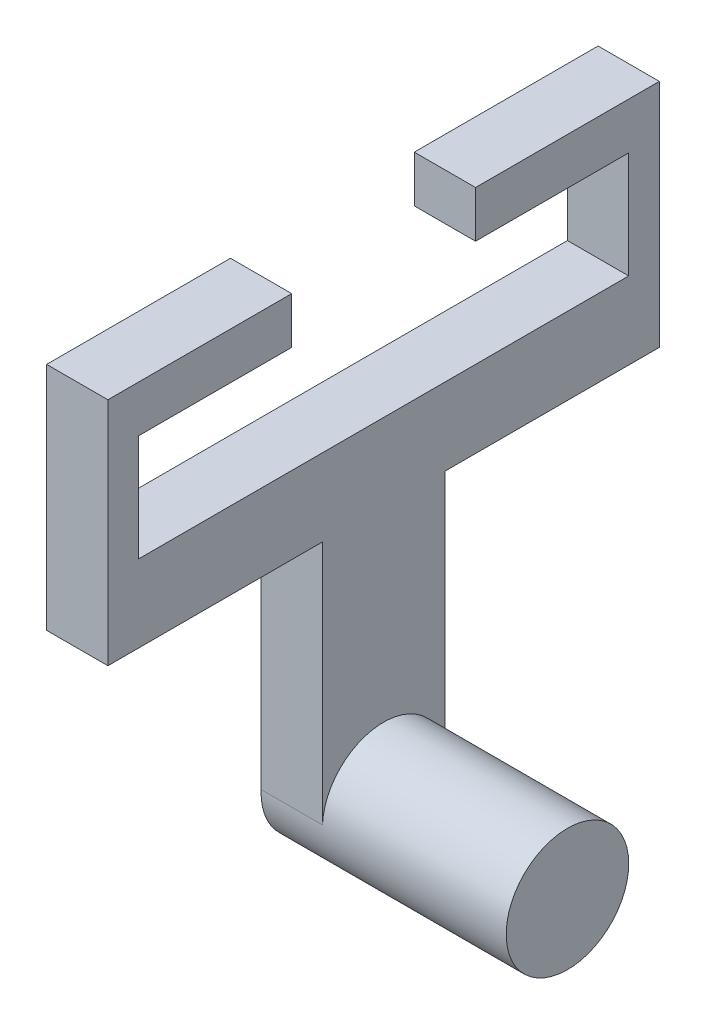
ISO-10303-21;
HEADER;
FILE_DESCRIPTION(('STEP AP214'),'2;1');
FILE_NAME('part.step','',(''),(''),'','','');
FILE_SCHEMA(('AUTOMOTIVE_DESIGN { 1 0 10303 214 1 1 1 1 }'));
ENDSEC;
DATA;
#1=APPLICATION_CONTEXT('core data for automotive mechanical design processes');
#2=APPLICATION_PROTOCOL_DEFINITION('international standard','automotive_design',2000,#1);
#3=PRODUCT_CONTEXT('',#1,'mechanical');
#4=PRODUCT('Part','Part','',(#3));
#5=PRODUCT_RELATED_PRODUCT_CATEGORY('part','',(#4));
#6=PRODUCT_DEFINITION_FORMATION('','',#4);
#7=PRODUCT_DEFINITION_CONTEXT('part definition',#1,'design');
#8=PRODUCT_DEFINITION('design','',#6,#7);
#9=PRODUCT_DEFINITION_SHAPE('','',#8);
#10=(LENGTH_UNIT() NAMED_UNIT(*) SI_UNIT(.MILLI.,.METRE.));
#11=(NAMED_UNIT(*) PLANE_ANGLE_UNIT() SI_UNIT($,.RADIAN.));
#12=(NAMED_UNIT(*) SI_UNIT($,.STERADIAN.) SOLID_ANGLE_UNIT());
#13=UNCERTAINTY_MEASURE_WITH_UNIT(LENGTH_MEASURE(1.E-05),#10,'distance_accuracy_value','');
#14=(GEOMETRIC_REPRESENTATION_CONTEXT(3) GLOBAL_UNCERTAINTY_ASSIGNED_CONTEXT((#13)) GLOBAL_UNIT_ASSIGNED_CONTEXT((#10,
#11,#12)) REPRESENTATION_CONTEXT('',''));
#15=CARTESIAN_POINT('',(0.,0.,0.));
#16=DIRECTION('',(0.,0.,1.));
#17=DIRECTION('',(1.,0.,0.));
#18=AXIS2_PLACEMENT_3D('',#15,#16,#17);
#19=CARTESIAN_POINT('',(12.7,0.60873287463422,-12.6854028035116));
#20=DIRECTION('',(0.,0.,-1.));
#21=DIRECTION('',(-1.,0.,0.));
#22=AXIS2_PLACEMENT_3D('',#19,#20,#21);
#23=PLANE('',#22);
#24=DIRECTION('',(0.,-1.,0.));
#25=VECTOR('',#24,1.);
#26=CARTESIAN_POINT('',(0.,0.60873287463422,-12.6854028035116));
#27=LINE('',#26,#25);
#28=CARTESIAN_POINT('',(0.,51.3912941545788,-12.6854028035116));
#29=VERTEX_POINT('',#28);
#30=CARTESIAN_POINT('',(0.,0.60873287463422,-12.6854028035116));
#31=VERTEX_POINT('',#30);
#32=EDGE_CURVE('E277',#29,#31,#27,.T.);
#33=ORIENTED_EDGE('',*,*,#32,.F.);
#34=DIRECTION('',(1.,0.,0.));
#35=VECTOR('',#34,1.);
#36=CARTESIAN_POINT('',(12.7,51.3912941545788,-12.6854028035116));
#37=LINE('',#36,#35);
#38=CARTESIAN_POINT('',(12.7,51.3912941545788,-12.6854028035116));
#39=VERTEX_POINT('',#38);
#40=EDGE_CURVE('E273',#29,#39,#37,.T.);
#41=ORIENTED_EDGE('',*,*,#40,.T.);
#42=DIRECTION('',(0.,-1.,0.));
#43=VECTOR('',#42,1.);
#44=CARTESIAN_POINT('',(12.7,0.60873287463422,-12.6854028035116));
#45=LINE('',#44,#43);
#46=CARTESIAN_POINT('',(12.7,0.60873287463422,-12.6854028035116));
#47=VERTEX_POINT('',#46);
#48=EDGE_CURVE('E280',#39,#47,#45,.T.);
#49=ORIENTED_EDGE('',*,*,#48,.T.);
#50=DIRECTION('',(-1.,0.,0.));
#51=VECTOR('',#50,1.);
#52=CARTESIAN_POINT('',(12.7,0.60873287463422,-12.6854028035116));
#53=LINE('',#52,#51);
#54=EDGE_CURVE('E288',#47,#31,#53,.T.);
#55=ORIENTED_EDGE('',*,*,#54,.T.);
#56=EDGE_LOOP('',(#33,#41,#49,#55));
#57=FACE_BOUND('',#56,.T.);
#58=ADVANCED_FACE('F47',(#57),#23,.T.);
#59=CARTESIAN_POINT('',(12.7,0.60873287463422,12.7145971964884));
#60=DIRECTION('',(0.,0.,1.));
#61=DIRECTION('',(1.,0.,0.));
#62=AXIS2_PLACEMENT_3D('',#59,#60,#61);
#63=PLANE('',#62);
#64=DIRECTION('',(0.,1.,0.));
#65=VECTOR('',#64,1.);
#66=CARTESIAN_POINT('',(12.7,0.60873287463422,12.7145971964884));
#67=LINE('',#66,#65);
#68=CARTESIAN_POINT('',(12.7,0.60873287463422,12.7145971964884));
#69=VERTEX_POINT('',#68);
#70=CARTESIAN_POINT('',(12.7,51.3912941545788,12.7145971964884));
#71=VERTEX_POINT('',#70);
#72=EDGE_CURVE('E283',#69,#71,#67,.T.);
#73=ORIENTED_EDGE('',*,*,#72,.T.);
#74=DIRECTION('',(-1.,0.,0.));
#75=VECTOR('',#74,1.);
#76=CARTESIAN_POINT('',(12.7,51.3912941545788,12.7145971964884));
#77=LINE('',#76,#75);
#78=CARTESIAN_POINT('',(0.,51.3912941545788,12.7145971964884));
#79=VERTEX_POINT('',#78);
#80=EDGE_CURVE('E11',#71,#79,#77,.T.);
#81=ORIENTED_EDGE('',*,*,#80,.T.);
#82=DIRECTION('',(0.,1.,0.));
#83=VECTOR('',#82,1.);
#84=CARTESIAN_POINT('',(0.,0.60873287463422,12.7145971964884));
#85=LINE('',#84,#83);
#86=CARTESIAN_POINT('',(0.,0.60873287463422,12.7145971964884));
#87=VERTEX_POINT('',#86);
#88=EDGE_CURVE('E281',#87,#79,#85,.T.);
#89=ORIENTED_EDGE('',*,*,#88,.F.);
#90=DIRECTION('',(-1.,0.,0.));
#91=VECTOR('',#90,1.);
#92=CARTESIAN_POINT('',(12.7,0.60873287463422,12.7145971964884));
#93=LINE('',#92,#91);
#94=EDGE_CURVE('E293',#69,#87,#93,.T.);
#95=ORIENTED_EDGE('',*,*,#94,.F.);
#96=EDGE_LOOP('',(#73,#81,#89,#95));
#97=FACE_BOUND('',#96,.T.);
#98=ADVANCED_FACE('F354',(#97),#63,.T.);
#99=CARTESIAN_POINT('',(50.8,0.,0.));
#100=DIRECTION('',(-1.,0.,0.));
#101=DIRECTION('',(0.,0.,1.));
#102=AXIS2_PLACEMENT_3D('',#99,#100,#101);
#103=CYLINDRICAL_SURFACE('',#102,12.7);
#104=CARTESIAN_POINT('',(50.8,0.,0.));
#105=DIRECTION('',(1.,0.,0.));
#106=DIRECTION('',(0.,0.,-1.));
#107=AXIS2_PLACEMENT_3D('',#104,#105,#106);
#108=CIRCLE('',#107,12.7);
#109=CARTESIAN_POINT('',(50.8,0.,-12.7));
#110=VERTEX_POINT('',#109);
#111=EDGE_CURVE('E296',#110,#110,#108,.T.);
#112=ORIENTED_EDGE('',*,*,#111,.F.);
#113=EDGE_LOOP('',(#112));
#114=FACE_BOUND('',#113,.T.);
#115=CARTESIAN_POINT('',(12.7,0.,0.));
#116=DIRECTION('',(1.,0.,0.));
#117=DIRECTION('',(0.,0.,-1.));
#118=AXIS2_PLACEMENT_3D('',#115,#116,#117);
#119=CIRCLE('',#118,12.7);
#120=CARTESIAN_POINT('',(12.7,0.60873287463422,12.6854028035116));
#121=VERTEX_POINT('',#120);
#122=EDGE_CURVE('E60',#47,#121,#119,.T.);
#123=ORIENTED_EDGE('',*,*,#122,.T.);
#124=DIRECTION('',(-1.,0.,0.));
#125=VECTOR('',#124,1.);
#126=CARTESIAN_POINT('',(50.8,0.60873287463422,12.6854028035116));
#127=LINE('',#126,#125);
#128=CARTESIAN_POINT('',(0.,0.60873287463422,12.6854028035116));
#129=VERTEX_POINT('',#128);
#130=EDGE_CURVE('E291',#121,#129,#127,.T.);
#131=ORIENTED_EDGE('',*,*,#130,.T.);
#132=CARTESIAN_POINT('',(0.,0.,0.));
#133=DIRECTION('',(1.,0.,0.));
#134=DIRECTION('',(0.,0.,-1.));
#135=AXIS2_PLACEMENT_3D('',#132,#133,#134);
#136=CIRCLE('',#135,12.7);
#137=EDGE_CURVE('E300',#129,#31,#136,.T.);
#138=ORIENTED_EDGE('',*,*,#137,.T.);
#139=ORIENTED_EDGE('',*,*,#54,.F.);
#140=EDGE_LOOP('',(#123,#131,#138,#139));
#141=FACE_BOUND('',#140,.T.);
#142=ADVANCED_FACE('F51',(#114,#141),#103,.T.);
#143=CARTESIAN_POINT('',(50.8,0.,0.));
#144=DIRECTION('',(1.,0.,0.));
#145=DIRECTION('',(0.,0.,-1.));
#146=AXIS2_PLACEMENT_3D('',#143,#144,#145);
#147=PLANE('',#146);
#148=ORIENTED_EDGE('',*,*,#111,.T.);
#149=EDGE_LOOP('',(#148));
#150=FACE_BOUND('',#149,.T.);
#151=ADVANCED_FACE('F364',(#150),#147,.T.);
#152=CARTESIAN_POINT('',(0.,0.,0.));
#153=DIRECTION('',(1.,0.,0.));
#154=DIRECTION('',(0.,0.,-1.));
#155=AXIS2_PLACEMENT_3D('',#152,#153,#154);
#156=PLANE('',#155);
#157=DIRECTION('',(0.,0.,-1.));
#158=VECTOR('',#157,1.);
#159=CARTESIAN_POINT('',(0.,51.3912941545788,-50.8));
#160=LINE('',#159,#158);
#161=CARTESIAN_POINT('',(0.,51.3912941545788,-57.15));
#162=VERTEX_POINT('',#161);
#163=EDGE_CURVE('E244',#29,#162,#160,.T.);
#164=ORIENTED_EDGE('',*,*,#163,.F.);
#165=ORIENTED_EDGE('',*,*,#32,.T.);
#166=ORIENTED_EDGE('',*,*,#137,.F.);
#167=DIRECTION('',(0.,0.,1.));
#168=VECTOR('',#167,1.);
#169=CARTESIAN_POINT('',(0.,0.60873287463422,-12.6854028035116));
#170=LINE('',#169,#168);
#171=EDGE_CURVE('E73',#129,#87,#170,.T.);
#172=ORIENTED_EDGE('',*,*,#171,.T.);
#173=ORIENTED_EDGE('',*,*,#88,.T.);
#174=CARTESIAN_POINT('',(0.,51.3912941545788,57.15));
#175=VERTEX_POINT('',#174);
#176=EDGE_CURVE('E268',#175,#79,#160,.T.);
#177=ORIENTED_EDGE('',*,*,#176,.F.);
#178=DIRECTION('',(0.,-1.,0.));
#179=VECTOR('',#178,1.);
#180=CARTESIAN_POINT('',(0.,51.3912941545788,57.15));
#181=LINE('',#180,#179);
#182=CARTESIAN_POINT('',(0.,99.1432941545788,57.15));
#183=VERTEX_POINT('',#182);
#184=EDGE_CURVE('E235',#183,#175,#181,.T.);
#185=ORIENTED_EDGE('',*,*,#184,.F.);
#186=DIRECTION('',(0.,0.,1.));
#187=VECTOR('',#186,1.);
#188=CARTESIAN_POINT('',(0.,99.1432941545788,57.15));
#189=LINE('',#188,#187);
#190=CARTESIAN_POINT('',(0.,99.1432941545788,19.05));
#191=VERTEX_POINT('',#190);
#192=EDGE_CURVE('E179',#191,#183,#189,.T.);
#193=ORIENTED_EDGE('',*,*,#192,.F.);
#194=DIRECTION('',(0.,1.,0.));
#195=VECTOR('',#194,1.);
#196=CARTESIAN_POINT('',(0.,89.4912941545788,19.05));
#197=LINE('',#196,#195);
#198=CARTESIAN_POINT('',(0.,89.4912941545788,19.05));
#199=VERTEX_POINT('',#198);
#200=EDGE_CURVE('E203',#199,#191,#197,.T.);
#201=ORIENTED_EDGE('',*,*,#200,.F.);
#202=DIRECTION('',(0.,0.,-1.));
#203=VECTOR('',#202,1.);
#204=CARTESIAN_POINT('',(0.,89.4912941545788,57.15));
#205=LINE('',#204,#203);
#206=CARTESIAN_POINT('',(0.,89.4912941545788,50.8));
#207=VERTEX_POINT('',#206);
#208=EDGE_CURVE('E187',#207,#199,#205,.T.);
#209=ORIENTED_EDGE('',*,*,#208,.F.);
#210=DIRECTION('',(0.,1.,0.));
#211=VECTOR('',#210,1.);
#212=CARTESIAN_POINT('',(0.,51.3912941545788,50.8));
#213=LINE('',#212,#211);
#214=CARTESIAN_POINT('',(0.,67.3932941545788,50.8));
#215=VERTEX_POINT('',#214);
#216=EDGE_CURVE('E236',#215,#207,#213,.T.);
#217=ORIENTED_EDGE('',*,*,#216,.F.);
#218=DIRECTION('',(0.,0.,1.));
#219=VECTOR('',#218,1.);
#220=CARTESIAN_POINT('',(0.,67.3932941545788,-50.8));
#221=LINE('',#220,#219);
#222=CARTESIAN_POINT('',(0.,67.3932941545788,-50.8));
#223=VERTEX_POINT('',#222);
#224=EDGE_CURVE('E266',#223,#215,#221,.T.);
#225=ORIENTED_EDGE('',*,*,#224,.F.);
#226=DIRECTION('',(0.,-1.,0.));
#227=VECTOR('',#226,1.);
#228=CARTESIAN_POINT('',(0.,51.3912941545788,-50.8));
#229=LINE('',#228,#227);
#230=CARTESIAN_POINT('',(0.,89.4912941545788,-50.8));
#231=VERTEX_POINT('',#230);
#232=EDGE_CURVE('E238',#231,#223,#229,.T.);
#233=ORIENTED_EDGE('',*,*,#232,.F.);
#234=DIRECTION('',(0.,0.,-1.));
#235=VECTOR('',#234,1.);
#236=CARTESIAN_POINT('',(0.,89.4912941545788,-57.15));
#237=LINE('',#236,#235);
#238=CARTESIAN_POINT('',(0.,89.4912941545788,-19.05));
#239=VERTEX_POINT('',#238);
#240=EDGE_CURVE('E217',#239,#231,#237,.T.);
#241=ORIENTED_EDGE('',*,*,#240,.F.);
#242=DIRECTION('',(0.,-1.,0.));
#243=VECTOR('',#242,1.);
#244=CARTESIAN_POINT('',(0.,89.4912941545788,-19.05));
#245=LINE('',#244,#243);
#246=CARTESIAN_POINT('',(0.,99.1432941545788,-19.05));
#247=VERTEX_POINT('',#246);
#248=EDGE_CURVE('E223',#247,#239,#245,.T.);
#249=ORIENTED_EDGE('',*,*,#248,.F.);
#250=DIRECTION('',(0.,0.,1.));
#251=VECTOR('',#250,1.);
#252=CARTESIAN_POINT('',(0.,99.1432941545788,-57.15));
#253=LINE('',#252,#251);
#254=CARTESIAN_POINT('',(0.,99.1432941545788,-57.15));
#255=VERTEX_POINT('',#254);
#256=EDGE_CURVE('E205',#255,#247,#253,.T.);
#257=ORIENTED_EDGE('',*,*,#256,.F.);
#258=DIRECTION('',(0.,1.,0.));
#259=VECTOR('',#258,1.);
#260=CARTESIAN_POINT('',(0.,51.3912941545788,-57.15));
#261=LINE('',#260,#259);
#262=EDGE_CURVE('E255',#162,#255,#261,.T.);
#263=ORIENTED_EDGE('',*,*,#262,.F.);
#264=EDGE_LOOP('',(#164,#165,#166,#172,#173,#177,#185,#193,#201,#209,#217,#225,#233,#241,#249,
#257,#263));
#265=FACE_BOUND('',#264,.T.);
#266=ADVANCED_FACE('F313',(#265),#156,.F.);
#267=CARTESIAN_POINT('',(12.7,0.60873287463422,-12.6854028035116));
#268=DIRECTION('',(0.,-1.,0.));
#269=DIRECTION('',(0.,0.,-1.));
#270=AXIS2_PLACEMENT_3D('',#267,#268,#269);
#271=PLANE('',#270);
#272=ORIENTED_EDGE('',*,*,#130,.F.);
#273=DIRECTION('',(0.,0.,1.));
#274=VECTOR('',#273,1.);
#275=CARTESIAN_POINT('',(12.7,0.60873287463422,-12.6854028035116));
#276=LINE('',#275,#274);
#277=EDGE_CURVE('E65',#121,#69,#276,.T.);
#278=ORIENTED_EDGE('',*,*,#277,.T.);
#279=ORIENTED_EDGE('',*,*,#94,.T.);
#280=ORIENTED_EDGE('',*,*,#171,.F.);
#281=EDGE_LOOP('',(#272,#278,#279,#280));
#282=FACE_BOUND('',#281,.T.);
#283=ADVANCED_FACE('F361',(#282),#271,.T.);
#284=CARTESIAN_POINT('',(12.7,0.,0.));
#285=DIRECTION('',(1.,0.,0.));
#286=DIRECTION('',(0.,0.,-1.));
#287=AXIS2_PLACEMENT_3D('',#284,#285,#286);
#288=PLANE('',#287);
#289=ORIENTED_EDGE('',*,*,#48,.F.);
#290=DIRECTION('',(0.,0.,-1.));
#291=VECTOR('',#290,1.);
#292=CARTESIAN_POINT('',(12.7,51.3912941545788,-50.8));
#293=LINE('',#292,#291);
#294=CARTESIAN_POINT('',(12.7,51.3912941545788,-57.15));
#295=VERTEX_POINT('',#294);
#296=EDGE_CURVE('E263',#39,#295,#293,.T.);
#297=ORIENTED_EDGE('',*,*,#296,.T.);
#298=DIRECTION('',(0.,1.,0.));
#299=VECTOR('',#298,1.);
#300=CARTESIAN_POINT('',(12.7,51.3912941545788,-57.15));
#301=LINE('',#300,#299);
#302=CARTESIAN_POINT('',(12.7,99.1432941545788,-57.15));
#303=VERTEX_POINT('',#302);
#304=EDGE_CURVE('E252',#295,#303,#301,.T.);
#305=ORIENTED_EDGE('',*,*,#304,.T.);
#306=DIRECTION('',(0.,0.,1.));
#307=VECTOR('',#306,1.);
#308=CARTESIAN_POINT('',(12.7,99.1432941545788,-57.15));
#309=LINE('',#308,#307);
#310=CARTESIAN_POINT('',(12.7,99.1432941545788,-19.05));
#311=VERTEX_POINT('',#310);
#312=EDGE_CURVE('E225',#303,#311,#309,.T.);
#313=ORIENTED_EDGE('',*,*,#312,.T.);
#314=DIRECTION('',(0.,-1.,0.));
#315=VECTOR('',#314,1.);
#316=CARTESIAN_POINT('',(12.7,89.4912941545788,-19.05));
#317=LINE('',#316,#315);
#318=CARTESIAN_POINT('',(12.7,89.4912941545788,-19.05));
#319=VERTEX_POINT('',#318);
#320=EDGE_CURVE('E227',#311,#319,#317,.T.);
#321=ORIENTED_EDGE('',*,*,#320,.T.);
#322=DIRECTION('',(0.,0.,-1.));
#323=VECTOR('',#322,1.);
#324=CARTESIAN_POINT('',(12.7,89.4912941545788,-57.15));
#325=LINE('',#324,#323);
#326=CARTESIAN_POINT('',(12.7,89.4912941545788,-50.8));
#327=VERTEX_POINT('',#326);
#328=EDGE_CURVE('E218',#319,#327,#325,.T.);
#329=ORIENTED_EDGE('',*,*,#328,.T.);
#330=DIRECTION('',(0.,-1.,0.));
#331=VECTOR('',#330,1.);
#332=CARTESIAN_POINT('',(12.7,51.3912941545788,-50.8));
#333=LINE('',#332,#331);
#334=CARTESIAN_POINT('',(12.7,67.3932941545788,-50.8));
#335=VERTEX_POINT('',#334);
#336=EDGE_CURVE('E251',#327,#335,#333,.T.);
#337=ORIENTED_EDGE('',*,*,#336,.T.);
#338=DIRECTION('',(0.,0.,1.));
#339=VECTOR('',#338,1.);
#340=CARTESIAN_POINT('',(12.7,67.3932941545788,-50.8));
#341=LINE('',#340,#339);
#342=CARTESIAN_POINT('',(12.7,67.3932941545788,50.8));
#343=VERTEX_POINT('',#342);
#344=EDGE_CURVE('E265',#335,#343,#341,.T.);
#345=ORIENTED_EDGE('',*,*,#344,.T.);
#346=DIRECTION('',(0.,1.,0.));
#347=VECTOR('',#346,1.);
#348=CARTESIAN_POINT('',(12.7,51.3912941545788,50.8));
#349=LINE('',#348,#347);
#350=CARTESIAN_POINT('',(12.7,89.4912941545788,50.8));
#351=VERTEX_POINT('',#350);
#352=EDGE_CURVE('E176',#343,#351,#349,.T.);
#353=ORIENTED_EDGE('',*,*,#352,.T.);
#354=DIRECTION('',(0.,0.,-1.));
#355=VECTOR('',#354,1.);
#356=CARTESIAN_POINT('',(12.7,89.4912941545788,57.15));
#357=LINE('',#356,#355);
#358=CARTESIAN_POINT('',(12.7,89.4912941545788,19.05));
#359=VERTEX_POINT('',#358);
#360=EDGE_CURVE('E170',#351,#359,#357,.T.);
#361=ORIENTED_EDGE('',*,*,#360,.T.);
#362=DIRECTION('',(0.,1.,0.));
#363=VECTOR('',#362,1.);
#364=CARTESIAN_POINT('',(12.7,89.4912941545788,19.05));
#365=LINE('',#364,#363);
#366=CARTESIAN_POINT('',(12.7,99.1432941545788,19.05));
#367=VERTEX_POINT('',#366);
#368=EDGE_CURVE('E173',#359,#367,#365,.T.);
#369=ORIENTED_EDGE('',*,*,#368,.T.);
#370=DIRECTION('',(0.,0.,1.));
#371=VECTOR('',#370,1.);
#372=CARTESIAN_POINT('',(12.7,99.1432941545788,57.15));
#373=LINE('',#372,#371);
#374=CARTESIAN_POINT('',(12.7,99.1432941545788,57.15));
#375=VERTEX_POINT('',#374);
#376=EDGE_CURVE('E191',#367,#375,#373,.T.);
#377=ORIENTED_EDGE('',*,*,#376,.T.);
#378=DIRECTION('',(0.,-1.,0.));
#379=VECTOR('',#378,1.);
#380=CARTESIAN_POINT('',(12.7,51.3912941545788,57.15));
#381=LINE('',#380,#379);
#382=CARTESIAN_POINT('',(12.7,51.3912941545788,57.15));
#383=VERTEX_POINT('',#382);
#384=EDGE_CURVE('E233',#375,#383,#381,.T.);
#385=ORIENTED_EDGE('',*,*,#384,.T.);
#386=EDGE_CURVE('E260',#383,#71,#293,.T.);
#387=ORIENTED_EDGE('',*,*,#386,.T.);
#388=ORIENTED_EDGE('',*,*,#72,.F.);
#389=ORIENTED_EDGE('',*,*,#277,.F.);
#390=ORIENTED_EDGE('',*,*,#122,.F.);
#391=EDGE_LOOP('',(#289,#297,#305,#313,#321,#329,#337,#345,#353,#361,#369,#377,#385,#387,#388,
#389,#390));
#392=FACE_BOUND('',#391,.T.);
#393=ADVANCED_FACE('F167',(#392),#288,.T.);
#394=CARTESIAN_POINT('',(12.7,51.3912941545788,-50.8));
#395=DIRECTION('',(0.,1.,0.));
#396=DIRECTION('',(0.,0.,1.));
#397=AXIS2_PLACEMENT_3D('',#394,#395,#396);
#398=PLANE('',#397);
#399=ORIENTED_EDGE('',*,*,#40,.F.);
#400=ORIENTED_EDGE('',*,*,#163,.T.);
#401=DIRECTION('',(-1.,0.,0.));
#402=VECTOR('',#401,1.);
#403=CARTESIAN_POINT('',(12.7,51.3912941545788,-57.15));
#404=LINE('',#403,#402);
#405=EDGE_CURVE('E186',#295,#162,#404,.T.);
#406=ORIENTED_EDGE('',*,*,#405,.F.);
#407=ORIENTED_EDGE('',*,*,#296,.F.);
#408=EDGE_LOOP('',(#399,#400,#406,#407));
#409=FACE_BOUND('',#408,.T.);
#410=ADVANCED_FACE('F311',(#409),#398,.F.);
#411=ORIENTED_EDGE('',*,*,#80,.F.);
#412=ORIENTED_EDGE('',*,*,#386,.F.);
#413=DIRECTION('',(-1.,0.,0.));
#414=VECTOR('',#413,1.);
#415=CARTESIAN_POINT('',(12.7,51.3912941545788,57.15));
#416=LINE('',#415,#414);
#417=EDGE_CURVE('E232',#383,#175,#416,.T.);
#418=ORIENTED_EDGE('',*,*,#417,.T.);
#419=ORIENTED_EDGE('',*,*,#176,.T.);
#420=EDGE_LOOP('',(#411,#412,#418,#419));
#421=FACE_BOUND('',#420,.T.);
#422=ADVANCED_FACE('F379',(#421),#398,.F.);
#423=CARTESIAN_POINT('',(12.7,67.3932941545788,-50.8));
#424=DIRECTION('',(0.,-1.,0.));
#425=DIRECTION('',(0.,0.,-1.));
#426=AXIS2_PLACEMENT_3D('',#423,#424,#425);
#427=PLANE('',#426);
#428=ORIENTED_EDGE('',*,*,#224,.T.);
#429=DIRECTION('',(-1.,0.,0.));
#430=VECTOR('',#429,1.);
#431=CARTESIAN_POINT('',(12.7,67.3932941545788,50.8));
#432=LINE('',#431,#430);
#433=EDGE_CURVE('E264',#343,#215,#432,.T.);
#434=ORIENTED_EDGE('',*,*,#433,.F.);
#435=ORIENTED_EDGE('',*,*,#344,.F.);
#436=DIRECTION('',(-1.,0.,0.));
#437=VECTOR('',#436,1.);
#438=CARTESIAN_POINT('',(12.7,67.3932941545788,-50.8));
#439=LINE('',#438,#437);
#440=EDGE_CURVE('E275',#335,#223,#439,.T.);
#441=ORIENTED_EDGE('',*,*,#440,.T.);
#442=EDGE_LOOP('',(#428,#434,#435,#441));
#443=FACE_BOUND('',#442,.T.);
#444=ADVANCED_FACE('F336',(#443),#427,.F.);
#445=CARTESIAN_POINT('',(12.7,51.3912941545788,-50.8));
#446=DIRECTION('',(0.,0.,-1.));
#447=DIRECTION('',(-1.,0.,0.));
#448=AXIS2_PLACEMENT_3D('',#445,#446,#447);
#449=PLANE('',#448);
#450=ORIENTED_EDGE('',*,*,#440,.F.);
#451=ORIENTED_EDGE('',*,*,#336,.F.);
#452=DIRECTION('',(-1.,0.,0.));
#453=VECTOR('',#452,1.);
#454=CARTESIAN_POINT('',(12.7,89.4912941545788,-50.8));
#455=LINE('',#454,#453);
#456=EDGE_CURVE('E247',#327,#231,#455,.T.);
#457=ORIENTED_EDGE('',*,*,#456,.T.);
#458=ORIENTED_EDGE('',*,*,#232,.T.);
#459=EDGE_LOOP('',(#450,#451,#457,#458));
#460=FACE_BOUND('',#459,.T.);
#461=ADVANCED_FACE('F332',(#460),#449,.F.);
#462=CARTESIAN_POINT('',(12.7,51.3912941545788,-57.15));
#463=DIRECTION('',(0.,0.,1.));
#464=DIRECTION('',(1.,0.,0.));
#465=AXIS2_PLACEMENT_3D('',#462,#463,#464);
#466=PLANE('',#465);
#467=ORIENTED_EDGE('',*,*,#262,.T.);
#468=DIRECTION('',(-1.,0.,0.));
#469=VECTOR('',#468,1.);
#470=CARTESIAN_POINT('',(12.7,99.1432941545788,-57.15));
#471=LINE('',#470,#469);
#472=EDGE_CURVE('E209',#303,#255,#471,.T.);
#473=ORIENTED_EDGE('',*,*,#472,.F.);
#474=ORIENTED_EDGE('',*,*,#304,.F.);
#475=ORIENTED_EDGE('',*,*,#405,.T.);
#476=EDGE_LOOP('',(#467,#473,#474,#475));
#477=FACE_BOUND('',#476,.T.);
#478=ADVANCED_FACE('F316',(#477),#466,.F.);
#479=CARTESIAN_POINT('',(12.7,51.3912941545788,50.8));
#480=DIRECTION('',(0.,0.,1.));
#481=DIRECTION('',(1.,0.,0.));
#482=AXIS2_PLACEMENT_3D('',#479,#480,#481);
#483=PLANE('',#482);
#484=ORIENTED_EDGE('',*,*,#352,.F.);
#485=ORIENTED_EDGE('',*,*,#433,.T.);
#486=ORIENTED_EDGE('',*,*,#216,.T.);
#487=DIRECTION('',(-1.,0.,0.));
#488=VECTOR('',#487,1.);
#489=CARTESIAN_POINT('',(12.7,89.4912941545788,50.8));
#490=LINE('',#489,#488);
#491=EDGE_CURVE('E243',#351,#207,#490,.T.);
#492=ORIENTED_EDGE('',*,*,#491,.F.);
#493=EDGE_LOOP('',(#484,#485,#486,#492));
#494=FACE_BOUND('',#493,.T.);
#495=ADVANCED_FACE('F342',(#494),#483,.F.);
#496=CARTESIAN_POINT('',(12.7,51.3912941545788,57.15));
#497=DIRECTION('',(0.,0.,-1.));
#498=DIRECTION('',(0.,1.,0.));
#499=AXIS2_PLACEMENT_3D('',#496,#497,#498);
#500=PLANE('',#499);
#501=ORIENTED_EDGE('',*,*,#184,.T.);
#502=ORIENTED_EDGE('',*,*,#417,.F.);
#503=ORIENTED_EDGE('',*,*,#384,.F.);
#504=DIRECTION('',(-1.,0.,0.));
#505=VECTOR('',#504,1.);
#506=CARTESIAN_POINT('',(12.7,99.1432941545788,57.15));
#507=LINE('',#506,#505);
#508=EDGE_CURVE('E200',#375,#183,#507,.T.);
#509=ORIENTED_EDGE('',*,*,#508,.T.);
#510=EDGE_LOOP('',(#501,#502,#503,#509));
#511=FACE_BOUND('',#510,.T.);
#512=ADVANCED_FACE('F341',(#511),#500,.F.);
#513=CARTESIAN_POINT('',(12.7,89.4912941545788,57.15));
#514=DIRECTION('',(0.,1.,0.));
#515=DIRECTION('',(0.,0.,1.));
#516=AXIS2_PLACEMENT_3D('',#513,#514,#515);
#517=PLANE('',#516);
#518=ORIENTED_EDGE('',*,*,#360,.F.);
#519=ORIENTED_EDGE('',*,*,#491,.T.);
#520=ORIENTED_EDGE('',*,*,#208,.T.);
#521=DIRECTION('',(-1.,0.,0.));
#522=VECTOR('',#521,1.);
#523=CARTESIAN_POINT('',(12.7,89.4912941545788,19.05));
#524=LINE('',#523,#522);
#525=EDGE_CURVE('E182',#359,#199,#524,.T.);
#526=ORIENTED_EDGE('',*,*,#525,.F.);
#527=EDGE_LOOP('',(#518,#519,#520,#526));
#528=FACE_BOUND('',#527,.T.);
#529=ADVANCED_FACE('F183',(#528),#517,.F.);
#530=CARTESIAN_POINT('',(12.7,89.4912941545788,19.05));
#531=DIRECTION('',(0.,0.,1.));
#532=DIRECTION('',(1.,0.,0.));
#533=AXIS2_PLACEMENT_3D('',#530,#531,#532);
#534=PLANE('',#533);
#535=ORIENTED_EDGE('',*,*,#200,.T.);
#536=DIRECTION('',(-1.,0.,0.));
#537=VECTOR('',#536,1.);
#538=CARTESIAN_POINT('',(12.7,99.1432941545788,19.05));
#539=LINE('',#538,#537);
#540=EDGE_CURVE('E188',#367,#191,#539,.T.);
#541=ORIENTED_EDGE('',*,*,#540,.F.);
#542=ORIENTED_EDGE('',*,*,#368,.F.);
#543=ORIENTED_EDGE('',*,*,#525,.T.);
#544=EDGE_LOOP('',(#535,#541,#542,#543));
#545=FACE_BOUND('',#544,.T.);
#546=ADVANCED_FACE('F194',(#545),#534,.F.);
#547=CARTESIAN_POINT('',(12.7,99.1432941545788,57.15));
#548=DIRECTION('',(0.,-1.,0.));
#549=DIRECTION('',(0.,0.,-1.));
#550=AXIS2_PLACEMENT_3D('',#547,#548,#549);
#551=PLANE('',#550);
#552=ORIENTED_EDGE('',*,*,#192,.T.);
#553=ORIENTED_EDGE('',*,*,#508,.F.);
#554=ORIENTED_EDGE('',*,*,#376,.F.);
#555=ORIENTED_EDGE('',*,*,#540,.T.);
#556=EDGE_LOOP('',(#552,#553,#554,#555));
#557=FACE_BOUND('',#556,.T.);
#558=ADVANCED_FACE('F381',(#557),#551,.F.);
#559=CARTESIAN_POINT('',(12.7,99.1432941545788,-57.15));
#560=DIRECTION('',(0.,-1.,0.));
#561=DIRECTION('',(0.,0.,-1.));
#562=AXIS2_PLACEMENT_3D('',#559,#560,#561);
#563=PLANE('',#562);
#564=ORIENTED_EDGE('',*,*,#256,.T.);
#565=DIRECTION('',(-1.,0.,0.));
#566=VECTOR('',#565,1.);
#567=CARTESIAN_POINT('',(12.7,99.1432941545788,-19.05));
#568=LINE('',#567,#566);
#569=EDGE_CURVE('E214',#311,#247,#568,.T.);
#570=ORIENTED_EDGE('',*,*,#569,.F.);
#571=ORIENTED_EDGE('',*,*,#312,.F.);
#572=ORIENTED_EDGE('',*,*,#472,.T.);
#573=EDGE_LOOP('',(#564,#570,#571,#572));
#574=FACE_BOUND('',#573,.T.);
#575=ADVANCED_FACE('F325',(#574),#563,.F.);
#576=CARTESIAN_POINT('',(12.7,89.4912941545788,-19.05));
#577=DIRECTION('',(0.,0.,-1.));
#578=DIRECTION('',(-1.,0.,0.));
#579=AXIS2_PLACEMENT_3D('',#576,#577,#578);
#580=PLANE('',#579);
#581=ORIENTED_EDGE('',*,*,#248,.T.);
#582=DIRECTION('',(-1.,0.,0.));
#583=VECTOR('',#582,1.);
#584=CARTESIAN_POINT('',(12.7,89.4912941545788,-19.05));
#585=LINE('',#584,#583);
#586=EDGE_CURVE('E211',#319,#239,#585,.T.);
#587=ORIENTED_EDGE('',*,*,#586,.F.);
#588=ORIENTED_EDGE('',*,*,#320,.F.);
#589=ORIENTED_EDGE('',*,*,#569,.T.);
#590=EDGE_LOOP('',(#581,#587,#588,#589));
#591=FACE_BOUND('',#590,.T.);
#592=ADVANCED_FACE('F328',(#591),#580,.F.);
#593=CARTESIAN_POINT('',(12.7,89.4912941545788,-57.15));
#594=DIRECTION('',(0.,1.,0.));
#595=DIRECTION('',(0.,0.,1.));
#596=AXIS2_PLACEMENT_3D('',#593,#594,#595);
#597=PLANE('',#596);
#598=ORIENTED_EDGE('',*,*,#456,.F.);
#599=ORIENTED_EDGE('',*,*,#328,.F.);
#600=ORIENTED_EDGE('',*,*,#586,.T.);
#601=ORIENTED_EDGE('',*,*,#240,.T.);
#602=EDGE_LOOP('',(#598,#599,#600,#601));
#603=FACE_BOUND('',#602,.T.);
#604=ADVANCED_FACE('F400',(#603),#597,.F.);
#605=CLOSED_SHELL('',(#58,#98,#142,#151,#266,#283,#393,#410,#422,#444,#461,#478,#495,#512,#529,
#546,#558,#575,#592,#604));
#606=MANIFOLD_SOLID_BREP('B2',#605);
#607=ADVANCED_BREP_SHAPE_REPRESENTATION('',(#18,#606),#14);
#608=SHAPE_DEFINITION_REPRESENTATION(#9,#607);
ENDSEC;
END-ISO-10303-21;
